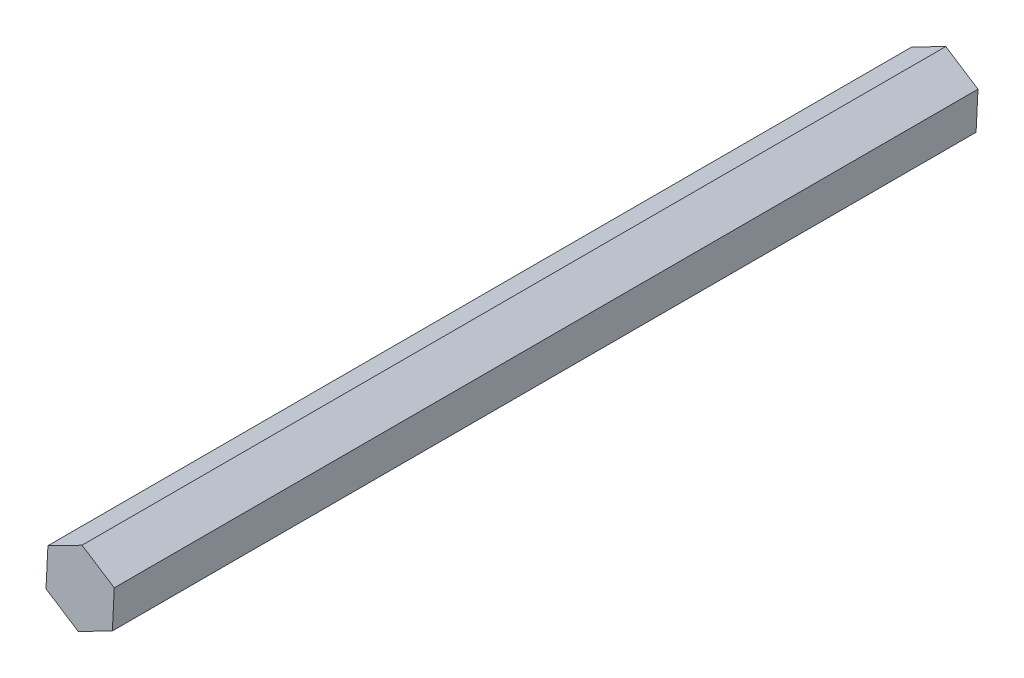
ISO-10303-21;
HEADER;
FILE_DESCRIPTION(('STEP AP214'),'2;1');
FILE_NAME('part.step','',(''),(''),'','','');
FILE_SCHEMA(('AUTOMOTIVE_DESIGN { 1 0 10303 214 1 1 1 1 }'));
ENDSEC;
DATA;
#1=APPLICATION_CONTEXT('core data for automotive mechanical design processes');
#2=APPLICATION_PROTOCOL_DEFINITION('international standard','automotive_design',2000,#1);
#3=PRODUCT_CONTEXT('',#1,'mechanical');
#4=PRODUCT('Part','Part','',(#3));
#5=PRODUCT_RELATED_PRODUCT_CATEGORY('part','',(#4));
#6=PRODUCT_DEFINITION_FORMATION('','',#4);
#7=PRODUCT_DEFINITION_CONTEXT('part definition',#1,'design');
#8=PRODUCT_DEFINITION('design','',#6,#7);
#9=PRODUCT_DEFINITION_SHAPE('','',#8);
#10=(LENGTH_UNIT() NAMED_UNIT(*) SI_UNIT(.MILLI.,.METRE.));
#11=(NAMED_UNIT(*) PLANE_ANGLE_UNIT() SI_UNIT($,.RADIAN.));
#12=(NAMED_UNIT(*) SI_UNIT($,.STERADIAN.) SOLID_ANGLE_UNIT());
#13=UNCERTAINTY_MEASURE_WITH_UNIT(LENGTH_MEASURE(1.E-05),#10,'distance_accuracy_value','');
#14=(GEOMETRIC_REPRESENTATION_CONTEXT(3) GLOBAL_UNCERTAINTY_ASSIGNED_CONTEXT((#13)) GLOBAL_UNIT_ASSIGNED_CONTEXT((#10,
#11,#12)) REPRESENTATION_CONTEXT('',''));
#15=CARTESIAN_POINT('',(0.,0.,0.));
#16=DIRECTION('',(0.,0.,1.));
#17=DIRECTION('',(1.,0.,0.));
#18=AXIS2_PLACEMENT_3D('',#15,#16,#17);
#19=CARTESIAN_POINT('',(0.366258464065122,7.32319520911699,165.1));
#20=DIRECTION('',(0.456116959989774,-0.88991983841787,0.));
#21=DIRECTION('',(0.88991983841787,0.456116959989774,0.));
#22=AXIS2_PLACEMENT_3D('',#19,#20,#21);
#23=PLANE('',#22);
#24=DIRECTION('',(-0.88991983841787,-0.456116959989773,0.));
#25=VECTOR('',#24,1.);
#26=CARTESIAN_POINT('',(0.366258464065122,7.32319520911699,0.));
#27=LINE('',#26,#25);
#28=CARTESIAN_POINT('',(0.366258464065122,7.32319520911699,0.));
#29=VERTEX_POINT('',#28);
#30=CARTESIAN_POINT('',(-6.15894385593525,3.97878673878996,0.));
#31=VERTEX_POINT('',#30);
#32=EDGE_CURVE('E128',#29,#31,#27,.T.);
#33=ORIENTED_EDGE('',*,*,#32,.T.);
#34=DIRECTION('',(0.,0.,-1.));
#35=VECTOR('',#34,1.);
#36=CARTESIAN_POINT('',(-6.15894385593525,3.97878673878996,165.1));
#37=LINE('',#36,#35);
#38=CARTESIAN_POINT('',(-6.15894385593525,3.97878673878996,165.1));
#39=VERTEX_POINT('',#38);
#40=EDGE_CURVE('E11',#39,#31,#37,.T.);
#41=ORIENTED_EDGE('',*,*,#40,.F.);
#42=DIRECTION('',(-0.88991983841787,-0.456116959989773,0.));
#43=VECTOR('',#42,1.);
#44=CARTESIAN_POINT('',(0.366258464065122,7.32319520911699,165.1));
#45=LINE('',#44,#43);
#46=CARTESIAN_POINT('',(0.366258464065122,7.32319520911699,165.1));
#47=VERTEX_POINT('',#46);
#48=EDGE_CURVE('E144',#47,#39,#45,.T.);
#49=ORIENTED_EDGE('',*,*,#48,.F.);
#50=DIRECTION('',(0.,0.,-1.));
#51=VECTOR('',#50,1.);
#52=CARTESIAN_POINT('',(0.366258464065122,7.32319520911699,165.1));
#53=LINE('',#52,#51);
#54=EDGE_CURVE('E124',#47,#29,#53,.T.);
#55=ORIENTED_EDGE('',*,*,#54,.T.);
#56=EDGE_LOOP('',(#33,#41,#49,#55));
#57=FACE_BOUND('',#56,.T.);
#58=ADVANCED_FACE('F39',(#57),#23,.F.);
#59=CARTESIAN_POINT('',(-6.15894385593525,3.97878673878996,165.1));
#60=DIRECTION('',(0.998751667396505,-0.0499510447608604,0.));
#61=DIRECTION('',(0.0499510447608604,0.998751667396505,0.));
#62=AXIS2_PLACEMENT_3D('',#59,#60,#61);
#63=PLANE('',#62);
#64=DIRECTION('',(-0.0499510447608604,-0.998751667396505,0.));
#65=VECTOR('',#64,1.);
#66=CARTESIAN_POINT('',(-6.15894385593525,3.97878673878996,0.));
#67=LINE('',#66,#65);
#68=CARTESIAN_POINT('',(-6.52520232000037,-3.34440847032703,0.));
#69=VERTEX_POINT('',#68);
#70=EDGE_CURVE('E132',#31,#69,#67,.T.);
#71=ORIENTED_EDGE('',*,*,#70,.T.);
#72=DIRECTION('',(0.,0.,-1.));
#73=VECTOR('',#72,1.);
#74=CARTESIAN_POINT('',(-6.52520232000037,-3.34440847032703,165.1));
#75=LINE('',#74,#73);
#76=CARTESIAN_POINT('',(-6.52520232000037,-3.34440847032703,165.1));
#77=VERTEX_POINT('',#76);
#78=EDGE_CURVE('E48',#77,#69,#75,.T.);
#79=ORIENTED_EDGE('',*,*,#78,.F.);
#80=DIRECTION('',(-0.0499510447608604,-0.998751667396505,0.));
#81=VECTOR('',#80,1.);
#82=CARTESIAN_POINT('',(-6.15894385593525,3.97878673878996,165.1));
#83=LINE('',#82,#81);
#84=EDGE_CURVE('E93',#39,#77,#83,.T.);
#85=ORIENTED_EDGE('',*,*,#84,.F.);
#86=ORIENTED_EDGE('',*,*,#40,.T.);
#87=EDGE_LOOP('',(#71,#79,#85,#86));
#88=FACE_BOUND('',#87,.T.);
#89=ADVANCED_FACE('F172',(#88),#63,.F.);
#90=CARTESIAN_POINT('',(-6.52520232000037,-3.34440847032703,165.1));
#91=DIRECTION('',(0.542634707406731,0.839968793657009,0.));
#92=DIRECTION('',(-0.839968793657009,0.542634707406731,0.));
#93=AXIS2_PLACEMENT_3D('',#90,#91,#92);
#94=PLANE('',#93);
#95=DIRECTION('',(0.839968793657009,-0.542634707406731,0.));
#96=VECTOR('',#95,1.);
#97=CARTESIAN_POINT('',(-6.52520232000037,-3.34440847032703,0.));
#98=LINE('',#97,#96);
#99=CARTESIAN_POINT('',(-0.366258464065118,-7.32319520911699,0.));
#100=VERTEX_POINT('',#99);
#101=EDGE_CURVE('E135',#69,#100,#98,.T.);
#102=ORIENTED_EDGE('',*,*,#101,.T.);
#103=DIRECTION('',(0.,0.,-1.));
#104=VECTOR('',#103,1.);
#105=CARTESIAN_POINT('',(-0.366258464065118,-7.32319520911699,165.1));
#106=LINE('',#105,#104);
#107=CARTESIAN_POINT('',(-0.366258464065118,-7.32319520911699,165.1));
#108=VERTEX_POINT('',#107);
#109=EDGE_CURVE('E117',#108,#100,#106,.T.);
#110=ORIENTED_EDGE('',*,*,#109,.F.);
#111=DIRECTION('',(0.839968793657009,-0.542634707406731,0.));
#112=VECTOR('',#111,1.);
#113=CARTESIAN_POINT('',(-6.52520232000037,-3.34440847032703,165.1));
#114=LINE('',#113,#112);
#115=EDGE_CURVE('E106',#77,#108,#114,.T.);
#116=ORIENTED_EDGE('',*,*,#115,.F.);
#117=ORIENTED_EDGE('',*,*,#78,.T.);
#118=EDGE_LOOP('',(#102,#110,#116,#117));
#119=FACE_BOUND('',#118,.T.);
#120=ADVANCED_FACE('F154',(#119),#94,.F.);
#121=CARTESIAN_POINT('',(-0.366258464065118,-7.32319520911699,165.1));
#122=DIRECTION('',(-0.456116959989773,0.88991983841787,0.));
#123=DIRECTION('',(-0.88991983841787,-0.456116959989773,0.));
#124=AXIS2_PLACEMENT_3D('',#121,#122,#123);
#125=PLANE('',#124);
#126=DIRECTION('',(0.88991983841787,0.456116959989773,0.));
#127=VECTOR('',#126,1.);
#128=CARTESIAN_POINT('',(-0.366258464065118,-7.32319520911699,0.));
#129=LINE('',#128,#127);
#130=CARTESIAN_POINT('',(6.15894385593524,-3.97878673878997,0.));
#131=VERTEX_POINT('',#130);
#132=EDGE_CURVE('E115',#100,#131,#129,.T.);
#133=ORIENTED_EDGE('',*,*,#132,.T.);
#134=DIRECTION('',(0.,0.,-1.));
#135=VECTOR('',#134,1.);
#136=CARTESIAN_POINT('',(6.15894385593524,-3.97878673878997,165.1));
#137=LINE('',#136,#135);
#138=CARTESIAN_POINT('',(6.15894385593524,-3.97878673878997,165.1));
#139=VERTEX_POINT('',#138);
#140=EDGE_CURVE('E112',#139,#131,#137,.T.);
#141=ORIENTED_EDGE('',*,*,#140,.F.);
#142=DIRECTION('',(0.88991983841787,0.456116959989773,0.));
#143=VECTOR('',#142,1.);
#144=CARTESIAN_POINT('',(-0.366258464065118,-7.32319520911699,165.1));
#145=LINE('',#144,#143);
#146=EDGE_CURVE('E100',#108,#139,#145,.T.);
#147=ORIENTED_EDGE('',*,*,#146,.F.);
#148=ORIENTED_EDGE('',*,*,#109,.T.);
#149=EDGE_LOOP('',(#133,#141,#147,#148));
#150=FACE_BOUND('',#149,.T.);
#151=ADVANCED_FACE('F113',(#150),#125,.F.);
#152=CARTESIAN_POINT('',(6.15894385593524,-3.97878673878997,165.1));
#153=DIRECTION('',(-0.998751667396505,0.0499510447608607,0.));
#154=DIRECTION('',(-0.0499510447608607,-0.998751667396505,0.));
#155=AXIS2_PLACEMENT_3D('',#152,#153,#154);
#156=PLANE('',#155);
#157=DIRECTION('',(0.0499510447608607,0.998751667396505,0.));
#158=VECTOR('',#157,1.);
#159=CARTESIAN_POINT('',(6.15894385593524,-3.97878673878997,0.));
#160=LINE('',#159,#158);
#161=CARTESIAN_POINT('',(6.52520232000037,3.34440847032703,0.));
#162=VERTEX_POINT('',#161);
#163=EDGE_CURVE('E79',#131,#162,#160,.T.);
#164=ORIENTED_EDGE('',*,*,#163,.T.);
#165=DIRECTION('',(0.,0.,-1.));
#166=VECTOR('',#165,1.);
#167=CARTESIAN_POINT('',(6.52520232000037,3.34440847032703,165.1));
#168=LINE('',#167,#166);
#169=CARTESIAN_POINT('',(6.52520232000037,3.34440847032703,165.1));
#170=VERTEX_POINT('',#169);
#171=EDGE_CURVE('E118',#170,#162,#168,.T.);
#172=ORIENTED_EDGE('',*,*,#171,.F.);
#173=DIRECTION('',(0.0499510447608607,0.998751667396505,0.));
#174=VECTOR('',#173,1.);
#175=CARTESIAN_POINT('',(6.15894385593524,-3.97878673878997,165.1));
#176=LINE('',#175,#174);
#177=EDGE_CURVE('E104',#139,#170,#176,.T.);
#178=ORIENTED_EDGE('',*,*,#177,.F.);
#179=ORIENTED_EDGE('',*,*,#140,.T.);
#180=EDGE_LOOP('',(#164,#172,#178,#179));
#181=FACE_BOUND('',#180,.T.);
#182=ADVANCED_FACE('F120',(#181),#156,.F.);
#183=CARTESIAN_POINT('',(6.52520232000037,3.34440847032703,165.1));
#184=DIRECTION('',(-0.542634707406731,-0.839968793657009,0.));
#185=DIRECTION('',(0.839968793657009,-0.542634707406731,0.));
#186=AXIS2_PLACEMENT_3D('',#183,#184,#185);
#187=PLANE('',#186);
#188=DIRECTION('',(-0.839968793657009,0.542634707406731,0.));
#189=VECTOR('',#188,1.);
#190=CARTESIAN_POINT('',(6.52520232000037,3.34440847032703,0.));
#191=LINE('',#190,#189);
#192=EDGE_CURVE('E85',#162,#29,#191,.T.);
#193=ORIENTED_EDGE('',*,*,#192,.T.);
#194=ORIENTED_EDGE('',*,*,#54,.F.);
#195=DIRECTION('',(-0.839968793657009,0.542634707406731,0.));
#196=VECTOR('',#195,1.);
#197=CARTESIAN_POINT('',(6.52520232000037,3.34440847032703,165.1));
#198=LINE('',#197,#196);
#199=EDGE_CURVE('E56',#170,#47,#198,.T.);
#200=ORIENTED_EDGE('',*,*,#199,.F.);
#201=ORIENTED_EDGE('',*,*,#171,.T.);
#202=EDGE_LOOP('',(#193,#194,#200,#201));
#203=FACE_BOUND('',#202,.T.);
#204=ADVANCED_FACE('F161',(#203),#187,.F.);
#205=CARTESIAN_POINT('',(0.,0.,165.1));
#206=DIRECTION('',(0.,0.,1.));
#207=DIRECTION('',(1.,0.,0.));
#208=AXIS2_PLACEMENT_3D('',#205,#206,#207);
#209=PLANE('',#208);
#210=ORIENTED_EDGE('',*,*,#48,.T.);
#211=ORIENTED_EDGE('',*,*,#84,.T.);
#212=ORIENTED_EDGE('',*,*,#115,.T.);
#213=ORIENTED_EDGE('',*,*,#146,.T.);
#214=ORIENTED_EDGE('',*,*,#177,.T.);
#215=ORIENTED_EDGE('',*,*,#199,.T.);
#216=EDGE_LOOP('',(#210,#211,#212,#213,#214,#215));
#217=FACE_BOUND('',#216,.T.);
#218=ADVANCED_FACE('F102',(#217),#209,.T.);
#219=CARTESIAN_POINT('',(0.,0.,0.));
#220=DIRECTION('',(0.,0.,1.));
#221=DIRECTION('',(1.,0.,0.));
#222=AXIS2_PLACEMENT_3D('',#219,#220,#221);
#223=PLANE('',#222);
#224=ORIENTED_EDGE('',*,*,#32,.F.);
#225=ORIENTED_EDGE('',*,*,#192,.F.);
#226=ORIENTED_EDGE('',*,*,#163,.F.);
#227=ORIENTED_EDGE('',*,*,#132,.F.);
#228=ORIENTED_EDGE('',*,*,#101,.F.);
#229=ORIENTED_EDGE('',*,*,#70,.F.);
#230=EDGE_LOOP('',(#224,#225,#226,#227,#228,#229));
#231=FACE_BOUND('',#230,.T.);
#232=ADVANCED_FACE('F157',(#231),#223,.F.);
#233=CLOSED_SHELL('',(#58,#89,#120,#151,#182,#204,#218,#232));
#234=MANIFOLD_SOLID_BREP('B2',#233);
#235=ADVANCED_BREP_SHAPE_REPRESENTATION('',(#18,#234),#14);
#236=SHAPE_DEFINITION_REPRESENTATION(#9,#235);
ENDSEC;
END-ISO-10303-21;
